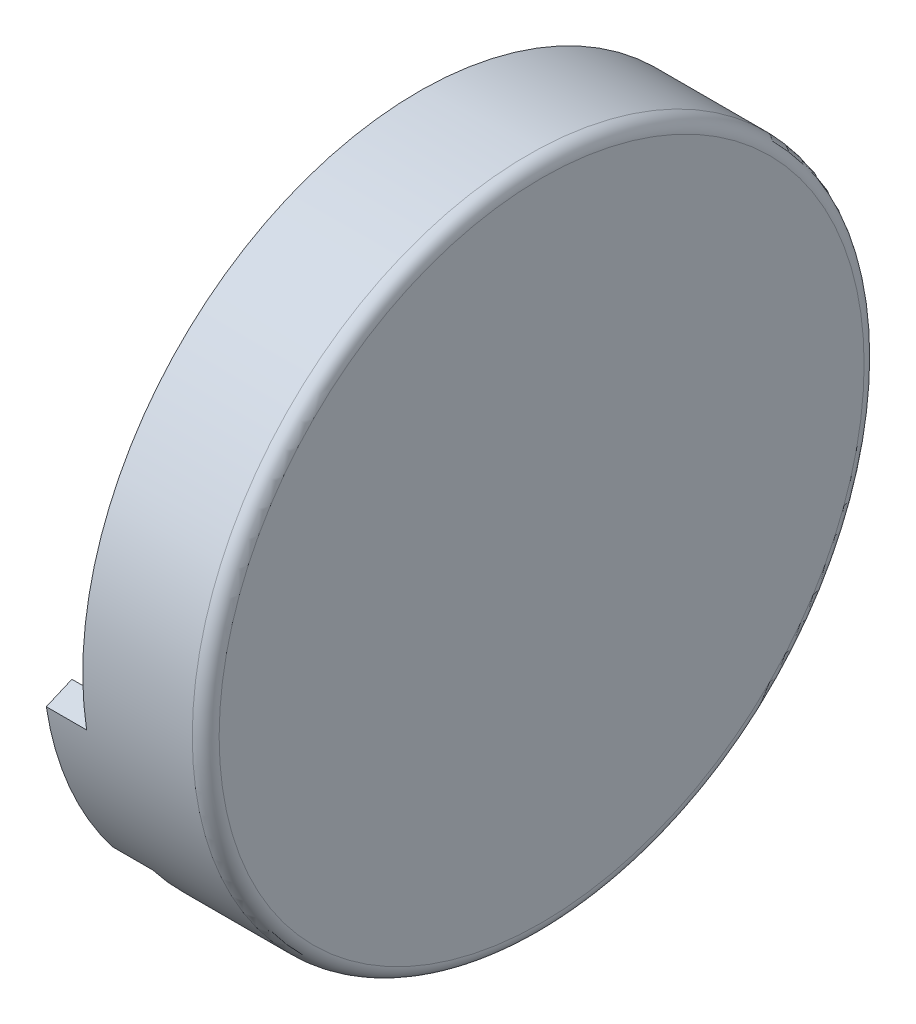
ISO-10303-21;
HEADER;
FILE_DESCRIPTION(('STEP AP214'),'2;1');
FILE_NAME('part.step','',(''),(''),'','','');
FILE_SCHEMA(('AUTOMOTIVE_DESIGN { 1 0 10303 214 1 1 1 1 }'));
ENDSEC;
DATA;
#1=APPLICATION_CONTEXT('core data for automotive mechanical design processes');
#2=APPLICATION_PROTOCOL_DEFINITION('international standard','automotive_design',2000,#1);
#3=PRODUCT_CONTEXT('',#1,'mechanical');
#4=PRODUCT('Part','Part','',(#3));
#5=PRODUCT_RELATED_PRODUCT_CATEGORY('part','',(#4));
#6=PRODUCT_DEFINITION_FORMATION('','',#4);
#7=PRODUCT_DEFINITION_CONTEXT('part definition',#1,'design');
#8=PRODUCT_DEFINITION('design','',#6,#7);
#9=PRODUCT_DEFINITION_SHAPE('','',#8);
#10=(LENGTH_UNIT() NAMED_UNIT(*) SI_UNIT(.MILLI.,.METRE.));
#11=(NAMED_UNIT(*) PLANE_ANGLE_UNIT() SI_UNIT($,.RADIAN.));
#12=(NAMED_UNIT(*) SI_UNIT($,.STERADIAN.) SOLID_ANGLE_UNIT());
#13=UNCERTAINTY_MEASURE_WITH_UNIT(LENGTH_MEASURE(1.E-05),#10,'distance_accuracy_value','');
#14=(GEOMETRIC_REPRESENTATION_CONTEXT(3) GLOBAL_UNCERTAINTY_ASSIGNED_CONTEXT((#13)) GLOBAL_UNIT_ASSIGNED_CONTEXT((#10,
#11,#12)) REPRESENTATION_CONTEXT('',''));
#15=CARTESIAN_POINT('',(0.,0.,0.));
#16=DIRECTION('',(0.,0.,1.));
#17=DIRECTION('',(1.,0.,0.));
#18=AXIS2_PLACEMENT_3D('',#15,#16,#17);
#19=CARTESIAN_POINT('',(54.66,0.,0.));
#20=DIRECTION('',(1.,0.,0.));
#21=DIRECTION('',(0.,0.,-1.));
#22=AXIS2_PLACEMENT_3D('',#19,#20,#21);
#23=PLANE('',#22);
#24=CARTESIAN_POINT('',(54.6599999999,0.,0.));
#25=DIRECTION('',(-1.,0.,0.));
#26=DIRECTION('',(0.,0.,-1.));
#27=AXIS2_PLACEMENT_3D('',#24,#25,#26);
#28=CIRCLE('',#27,4.7999999999);
#29=CARTESIAN_POINT('',(54.65999999994,0.,-4.79999999993));
#30=VERTEX_POINT('',#29);
#31=CARTESIAN_POINT('',(54.65999999994,0.,4.79999999997));
#32=VERTEX_POINT('',#31);
#33=EDGE_CURVE('E64',#30,#32,#28,.T.);
#34=ORIENTED_EDGE('',*,*,#33,.F.);
#35=CARTESIAN_POINT('',(54.6599999999,0.,0.));
#36=DIRECTION('',(-1.,0.,0.));
#37=DIRECTION('',(0.,0.,1.));
#38=AXIS2_PLACEMENT_3D('',#35,#36,#37);
#39=CIRCLE('',#38,4.8);
#40=EDGE_CURVE('E107',#32,#30,#39,.T.);
#41=ORIENTED_EDGE('',*,*,#40,.F.);
#42=EDGE_LOOP('',(#34,#41));
#43=FACE_BOUND('',#42,.T.);
#44=ADVANCED_FACE('F17',(#43),#23,.T.);
#45=CARTESIAN_POINT('',(52.23,6.16990902813086E-11,-2.74900102681386E-11));
#46=DIRECTION('',(1.,0.,0.));
#47=DIRECTION('',(0.,0.,-1.));
#48=AXIS2_PLACEMENT_3D('',#45,#46,#47);
#49=PLANE('',#48);
#50=DIRECTION('',(0.,-0.393941909582384,0.919135339258906));
#51=VECTOR('',#50,1.);
#52=CARTESIAN_POINT('',(52.23,-0.595024774430155,4.56135347433351));
#53=LINE('',#52,#51);
#54=CARTESIAN_POINT('',(52.23,-0.595024774430156,4.56135347433351));
#55=VERTEX_POINT('',#54);
#56=CARTESIAN_POINT('',(52.23,-0.758243894861696,4.94217221431073));
#57=VERTEX_POINT('',#56);
#58=EDGE_CURVE('E98',#55,#57,#53,.T.);
#59=ORIENTED_EDGE('',*,*,#58,.F.);
#60=CARTESIAN_POINT('',(52.23,0.,0.));
#61=DIRECTION('',(-1.,0.,0.));
#62=DIRECTION('',(0.,0.,1.));
#63=AXIS2_PLACEMENT_3D('',#60,#61,#62);
#64=CIRCLE('',#63,4.6);
#65=CARTESIAN_POINT('',(52.23,-2.89286312258763,3.57649870040135));
#66=VERTEX_POINT('',#65);
#67=EDGE_CURVE('E130',#55,#66,#64,.F.);
#68=ORIENTED_EDGE('',*,*,#67,.T.);
#69=DIRECTION('',(0.,-0.393941909582387,0.919135339258905));
#70=VECTOR('',#69,1.);
#71=CARTESIAN_POINT('',(52.23,-1.14891917401193,-0.492427387005473));
#72=LINE('',#71,#70);
#73=CARTESIAN_POINT('',(52.23,-3.05608224301829,3.95731744037654));
#74=VERTEX_POINT('',#73);
#75=EDGE_CURVE('E113',#66,#74,#72,.T.);
#76=ORIENTED_EDGE('',*,*,#75,.T.);
#77=CARTESIAN_POINT('',(52.23,0.,0.));
#78=DIRECTION('',(1.,0.,0.));
#79=DIRECTION('',(0.,0.,-1.));
#80=AXIS2_PLACEMENT_3D('',#77,#78,#79);
#81=CIRCLE('',#80,5.);
#82=EDGE_CURVE('E110',#57,#74,#81,.T.);
#83=ORIENTED_EDGE('',*,*,#82,.F.);
#84=EDGE_LOOP('',(#59,#68,#76,#83));
#85=FACE_BOUND('',#84,.T.);
#86=ADVANCED_FACE('F111',(#85),#49,.F.);
#87=CARTESIAN_POINT('',(52.23,6.16990902813086E-11,-2.74900102681386E-11));
#88=DIRECTION('',(1.,0.,0.));
#89=DIRECTION('',(0.,0.,-1.));
#90=AXIS2_PLACEMENT_3D('',#87,#88,#89);
#91=PLANE('',#90);
#92=DIRECTION('',(0.,-0.393941909582387,0.919135339258905));
#93=VECTOR('',#92,1.);
#94=CARTESIAN_POINT('',(52.23,-1.14891917401193,-0.492427387005473));
#95=LINE('',#94,#93);
#96=CARTESIAN_POINT('',(52.23,0.758243894955372,-4.94217221429635));
#97=VERTEX_POINT('',#96);
#98=CARTESIAN_POINT('',(52.23,0.595024774524707,-4.56135347432117));
#99=VERTEX_POINT('',#98);
#100=EDGE_CURVE('E50',#97,#99,#95,.T.);
#101=ORIENTED_EDGE('',*,*,#100,.T.);
#102=CARTESIAN_POINT('',(52.23,0.,0.));
#103=DIRECTION('',(-1.,0.,0.));
#104=DIRECTION('',(0.,0.,1.));
#105=AXIS2_PLACEMENT_3D('',#102,#103,#104);
#106=CIRCLE('',#105,4.6);
#107=CARTESIAN_POINT('',(52.23,2.89286312266176,-3.57649870034139));
#108=VERTEX_POINT('',#107);
#109=EDGE_CURVE('E56',#99,#108,#106,.F.);
#110=ORIENTED_EDGE('',*,*,#109,.T.);
#111=DIRECTION('',(0.,0.393941909582387,-0.919135339258905));
#112=VECTOR('',#111,1.);
#113=CARTESIAN_POINT('',(52.23,1.14891917413533,0.492427386950493));
#114=LINE('',#113,#112);
#115=CARTESIAN_POINT('',(52.23,3.0560822430933,-3.95731744031861));
#116=VERTEX_POINT('',#115);
#117=EDGE_CURVE('E138',#108,#116,#114,.T.);
#118=ORIENTED_EDGE('',*,*,#117,.T.);
#119=CARTESIAN_POINT('',(52.23,0.,0.));
#120=DIRECTION('',(1.,0.,0.));
#121=DIRECTION('',(0.,0.,-1.));
#122=AXIS2_PLACEMENT_3D('',#119,#120,#121);
#123=CIRCLE('',#122,5.);
#124=EDGE_CURVE('E123',#97,#116,#123,.T.);
#125=ORIENTED_EDGE('',*,*,#124,.F.);
#126=EDGE_LOOP('',(#101,#110,#118,#125));
#127=FACE_BOUND('',#126,.T.);
#128=ADVANCED_FACE('F146',(#127),#91,.F.);
#129=CARTESIAN_POINT('',(54.4599999999,0.,0.));
#130=DIRECTION('',(-1.,0.,0.));
#131=DIRECTION('',(0.,0.,-1.));
#132=AXIS2_PLACEMENT_3D('',#129,#130,#131);
#133=TOROIDAL_SURFACE('',#132,4.7999999999,0.200000000000003);
#134=ORIENTED_EDGE('',*,*,#33,.T.);
#135=ORIENTED_EDGE('',*,*,#40,.T.);
#136=EDGE_LOOP('',(#134,#135));
#137=FACE_BOUND('',#136,.T.);
#138=CARTESIAN_POINT('',(54.46,0.,0.));
#139=DIRECTION('',(1.,0.,0.));
#140=DIRECTION('',(0.,0.,-1.));
#141=AXIS2_PLACEMENT_3D('',#138,#139,#140);
#142=CIRCLE('',#141,5.);
#143=CARTESIAN_POINT('',(54.46,0.,-5.));
#144=VERTEX_POINT('',#143);
#145=EDGE_CURVE('E172',#144,#144,#142,.F.);
#146=ORIENTED_EDGE('',*,*,#145,.F.);
#147=EDGE_LOOP('',(#146));
#148=FACE_BOUND('',#147,.T.);
#149=ADVANCED_FACE('F140',(#137,#148),#133,.T.);
#150=CARTESIAN_POINT('',(52.53,1.14891917413533,0.492427386950493));
#151=DIRECTION('',(0.,-0.919135339258905,-0.393941909582387));
#152=DIRECTION('',(0.,0.393941909582387,-0.919135339258905));
#153=AXIS2_PLACEMENT_3D('',#150,#151,#152);
#154=PLANE('',#153);
#155=ORIENTED_EDGE('',*,*,#117,.F.);
#156=DIRECTION('',(-1.,0.,0.));
#157=VECTOR('',#156,1.);
#158=CARTESIAN_POINT('',(52.53,2.89286312266176,-3.57649870034139));
#159=LINE('',#158,#157);
#160=CARTESIAN_POINT('',(52.83,2.89286312266176,-3.57649870034139));
#161=VERTEX_POINT('',#160);
#162=EDGE_CURVE('E134',#108,#161,#159,.F.);
#163=ORIENTED_EDGE('',*,*,#162,.T.);
#164=DIRECTION('',(0.,-0.393941909582385,0.919135339258906));
#165=VECTOR('',#164,1.);
#166=CARTESIAN_POINT('',(52.83,3.0560822430933,-3.95731744031861));
#167=LINE('',#166,#165);
#168=CARTESIAN_POINT('',(52.83,3.0560822430933,-3.95731744031861));
#169=VERTEX_POINT('',#168);
#170=EDGE_CURVE('E171',#169,#161,#167,.T.);
#171=ORIENTED_EDGE('',*,*,#170,.F.);
#172=DIRECTION('',(1.,0.,0.));
#173=VECTOR('',#172,1.);
#174=CARTESIAN_POINT('',(53.745,3.0560822430933,-3.95731744031861));
#175=LINE('',#174,#173);
#176=EDGE_CURVE('E175',#116,#169,#175,.T.);
#177=ORIENTED_EDGE('',*,*,#176,.F.);
#178=EDGE_LOOP('',(#155,#163,#171,#177));
#179=FACE_BOUND('',#178,.T.);
#180=ADVANCED_FACE('F145',(#179),#154,.F.);
#181=CARTESIAN_POINT('',(52.53,0.,0.));
#182=DIRECTION('',(-1.,0.,0.));
#183=DIRECTION('',(0.,0.,1.));
#184=AXIS2_PLACEMENT_3D('',#181,#182,#183);
#185=CYLINDRICAL_SURFACE('',#184,4.6);
#186=ORIENTED_EDGE('',*,*,#109,.F.);
#187=DIRECTION('',(1.,0.,0.));
#188=VECTOR('',#187,1.);
#189=CARTESIAN_POINT('',(52.53,0.595024774524706,-4.56135347432117));
#190=LINE('',#189,#188);
#191=CARTESIAN_POINT('',(52.83,0.595024774524705,-4.56135347432117));
#192=VERTEX_POINT('',#191);
#193=EDGE_CURVE('E116',#99,#192,#190,.T.);
#194=ORIENTED_EDGE('',*,*,#193,.T.);
#195=CARTESIAN_POINT('',(52.83,0.,0.));
#196=DIRECTION('',(-1.,0.,0.));
#197=DIRECTION('',(0.,0.,1.));
#198=AXIS2_PLACEMENT_3D('',#195,#196,#197);
#199=CIRCLE('',#198,4.6);
#200=EDGE_CURVE('E168',#161,#192,#199,.T.);
#201=ORIENTED_EDGE('',*,*,#200,.F.);
#202=ORIENTED_EDGE('',*,*,#162,.F.);
#203=EDGE_LOOP('',(#186,#194,#201,#202));
#204=FACE_BOUND('',#203,.T.);
#205=ADVANCED_FACE('F209',(#204),#185,.F.);
#206=CARTESIAN_POINT('',(52.53,-1.14891917401193,-0.492427387005473));
#207=DIRECTION('',(0.,0.919135339258905,0.393941909582387));
#208=DIRECTION('',(0.,-0.393941909582387,0.919135339258905));
#209=AXIS2_PLACEMENT_3D('',#206,#207,#208);
#210=PLANE('',#209);
#211=DIRECTION('',(0.,0.393941909582389,-0.919135339258904));
#212=VECTOR('',#211,1.);
#213=CARTESIAN_POINT('',(52.83,0.595024774524702,-4.56135347432117));
#214=LINE('',#213,#212);
#215=CARTESIAN_POINT('',(52.83,0.75824389495537,-4.94217221429635));
#216=VERTEX_POINT('',#215);
#217=EDGE_CURVE('E167',#192,#216,#214,.T.);
#218=ORIENTED_EDGE('',*,*,#217,.F.);
#219=ORIENTED_EDGE('',*,*,#193,.F.);
#220=ORIENTED_EDGE('',*,*,#100,.F.);
#221=DIRECTION('',(1.,0.,0.));
#222=VECTOR('',#221,1.);
#223=CARTESIAN_POINT('',(53.745,0.758243894955369,-4.94217221429635));
#224=LINE('',#223,#222);
#225=EDGE_CURVE('E120',#216,#97,#224,.F.);
#226=ORIENTED_EDGE('',*,*,#225,.F.);
#227=EDGE_LOOP('',(#218,#219,#220,#226));
#228=FACE_BOUND('',#227,.T.);
#229=ADVANCED_FACE('F205',(#228),#210,.F.);
#230=CARTESIAN_POINT('',(52.53,-1.14891917401193,-0.492427387005473));
#231=DIRECTION('',(0.,0.919135339258905,0.393941909582387));
#232=DIRECTION('',(0.,-0.393941909582387,0.919135339258905));
#233=AXIS2_PLACEMENT_3D('',#230,#231,#232);
#234=PLANE('',#233);
#235=ORIENTED_EDGE('',*,*,#75,.F.);
#236=DIRECTION('',(-1.,0.,0.));
#237=VECTOR('',#236,1.);
#238=CARTESIAN_POINT('',(52.53,-2.89286312258763,3.57649870040135));
#239=LINE('',#238,#237);
#240=CARTESIAN_POINT('',(52.83,-2.89286312258762,3.57649870040136));
#241=VERTEX_POINT('',#240);
#242=EDGE_CURVE('E125',#66,#241,#239,.F.);
#243=ORIENTED_EDGE('',*,*,#242,.T.);
#244=DIRECTION('',(0.,0.393941909582385,-0.919135339258906));
#245=VECTOR('',#244,1.);
#246=CARTESIAN_POINT('',(52.83,-3.05608224301829,3.95731744037654));
#247=LINE('',#246,#245);
#248=CARTESIAN_POINT('',(52.83,-3.05608224301829,3.95731744037654));
#249=VERTEX_POINT('',#248);
#250=EDGE_CURVE('E164',#249,#241,#247,.T.);
#251=ORIENTED_EDGE('',*,*,#250,.F.);
#252=DIRECTION('',(1.,0.,0.));
#253=VECTOR('',#252,1.);
#254=CARTESIAN_POINT('',(52.53,-3.05608224301829,3.95731744037654));
#255=LINE('',#254,#253);
#256=EDGE_CURVE('E131',#74,#249,#255,.T.);
#257=ORIENTED_EDGE('',*,*,#256,.F.);
#258=EDGE_LOOP('',(#235,#243,#251,#257));
#259=FACE_BOUND('',#258,.T.);
#260=ADVANCED_FACE('F223',(#259),#234,.F.);
#261=CARTESIAN_POINT('',(52.53,0.,0.));
#262=DIRECTION('',(-1.,0.,0.));
#263=DIRECTION('',(0.,0.,1.));
#264=AXIS2_PLACEMENT_3D('',#261,#262,#263);
#265=CYLINDRICAL_SURFACE('',#264,4.6);
#266=CARTESIAN_POINT('',(52.83,0.,0.));
#267=DIRECTION('',(-1.,0.,0.));
#268=DIRECTION('',(0.,0.,1.));
#269=AXIS2_PLACEMENT_3D('',#266,#267,#268);
#270=CIRCLE('',#269,4.6);
#271=CARTESIAN_POINT('',(52.83,-0.595024774430156,4.56135347433351));
#272=VERTEX_POINT('',#271);
#273=EDGE_CURVE('E161',#241,#272,#270,.T.);
#274=ORIENTED_EDGE('',*,*,#273,.F.);
#275=ORIENTED_EDGE('',*,*,#242,.F.);
#276=ORIENTED_EDGE('',*,*,#67,.F.);
#277=DIRECTION('',(1.,0.,0.));
#278=VECTOR('',#277,1.);
#279=CARTESIAN_POINT('',(52.53,-0.595024774430159,4.56135347433351));
#280=LINE('',#279,#278);
#281=EDGE_CURVE('E104',#55,#272,#280,.T.);
#282=ORIENTED_EDGE('',*,*,#281,.T.);
#283=EDGE_LOOP('',(#274,#275,#276,#282));
#284=FACE_BOUND('',#283,.T.);
#285=ADVANCED_FACE('F221',(#284),#265,.F.);
#286=CARTESIAN_POINT('',(52.53,1.14891917413533,0.492427386950493));
#287=DIRECTION('',(0.,-0.919135339258905,-0.393941909582387));
#288=DIRECTION('',(0.,0.393941909582387,-0.919135339258905));
#289=AXIS2_PLACEMENT_3D('',#286,#287,#288);
#290=PLANE('',#289);
#291=DIRECTION('',(0.,-0.393941909582384,0.919135339258906));
#292=VECTOR('',#291,1.);
#293=CARTESIAN_POINT('',(52.83,-0.595024774430155,4.56135347433351));
#294=LINE('',#293,#292);
#295=CARTESIAN_POINT('',(52.83,-0.758243894861696,4.94217221431073));
#296=VERTEX_POINT('',#295);
#297=EDGE_CURVE('E29',#272,#296,#294,.T.);
#298=ORIENTED_EDGE('',*,*,#297,.F.);
#299=ORIENTED_EDGE('',*,*,#281,.F.);
#300=ORIENTED_EDGE('',*,*,#58,.T.);
#301=DIRECTION('',(1.,0.,0.));
#302=VECTOR('',#301,1.);
#303=CARTESIAN_POINT('',(52.53,-0.7582438948617,4.94217221431073));
#304=LINE('',#303,#302);
#305=EDGE_CURVE('E102',#296,#57,#304,.F.);
#306=ORIENTED_EDGE('',*,*,#305,.F.);
#307=EDGE_LOOP('',(#298,#299,#300,#306));
#308=FACE_BOUND('',#307,.T.);
#309=ADVANCED_FACE('F101',(#308),#290,.F.);
#310=CARTESIAN_POINT('',(53.745,0.,0.));
#311=DIRECTION('',(1.,0.,0.));
#312=DIRECTION('',(0.,0.,-1.));
#313=AXIS2_PLACEMENT_3D('',#310,#311,#312);
#314=CYLINDRICAL_SURFACE('',#313,5.);
#315=ORIENTED_EDGE('',*,*,#256,.T.);
#316=CARTESIAN_POINT('',(52.83,0.,0.));
#317=DIRECTION('',(1.,0.,0.));
#318=DIRECTION('',(0.,0.,-1.));
#319=AXIS2_PLACEMENT_3D('',#316,#317,#318);
#320=CIRCLE('',#319,5.);
#321=EDGE_CURVE('E165',#216,#249,#320,.F.);
#322=ORIENTED_EDGE('',*,*,#321,.F.);
#323=ORIENTED_EDGE('',*,*,#225,.T.);
#324=ORIENTED_EDGE('',*,*,#124,.T.);
#325=ORIENTED_EDGE('',*,*,#176,.T.);
#326=CARTESIAN_POINT('',(52.83,0.,0.));
#327=DIRECTION('',(1.,0.,0.));
#328=DIRECTION('',(0.,0.,-1.));
#329=AXIS2_PLACEMENT_3D('',#326,#327,#328);
#330=CIRCLE('',#329,5.);
#331=EDGE_CURVE('E11',#296,#169,#330,.F.);
#332=ORIENTED_EDGE('',*,*,#331,.F.);
#333=ORIENTED_EDGE('',*,*,#305,.T.);
#334=ORIENTED_EDGE('',*,*,#82,.T.);
#335=EDGE_LOOP('',(#315,#322,#323,#324,#325,#332,#333,#334));
#336=FACE_BOUND('',#335,.T.);
#337=ORIENTED_EDGE('',*,*,#145,.T.);
#338=EDGE_LOOP('',(#337));
#339=FACE_BOUND('',#338,.T.);
#340=ADVANCED_FACE('F118',(#336,#339),#314,.T.);
#341=CARTESIAN_POINT('',(52.83,0.,0.));
#342=DIRECTION('',(-1.,0.,0.));
#343=DIRECTION('',(0.,0.,1.));
#344=AXIS2_PLACEMENT_3D('',#341,#342,#343);
#345=PLANE('',#344);
#346=ORIENTED_EDGE('',*,*,#297,.T.);
#347=ORIENTED_EDGE('',*,*,#331,.T.);
#348=ORIENTED_EDGE('',*,*,#170,.T.);
#349=ORIENTED_EDGE('',*,*,#200,.T.);
#350=ORIENTED_EDGE('',*,*,#217,.T.);
#351=ORIENTED_EDGE('',*,*,#321,.T.);
#352=ORIENTED_EDGE('',*,*,#250,.T.);
#353=ORIENTED_EDGE('',*,*,#273,.T.);
#354=EDGE_LOOP('',(#346,#347,#348,#349,#350,#351,#352,#353));
#355=FACE_BOUND('',#354,.T.);
#356=ADVANCED_FACE('F211',(#355),#345,.T.);
#357=CLOSED_SHELL('',(#44,#86,#128,#149,#180,#205,#229,#260,#285,#309,#340,#356));
#358=MANIFOLD_SOLID_BREP('B1',#357);
#359=ADVANCED_BREP_SHAPE_REPRESENTATION('',(#18,#358),#14);
#360=SHAPE_DEFINITION_REPRESENTATION(#9,#359);
ENDSEC;
END-ISO-10303-21;
